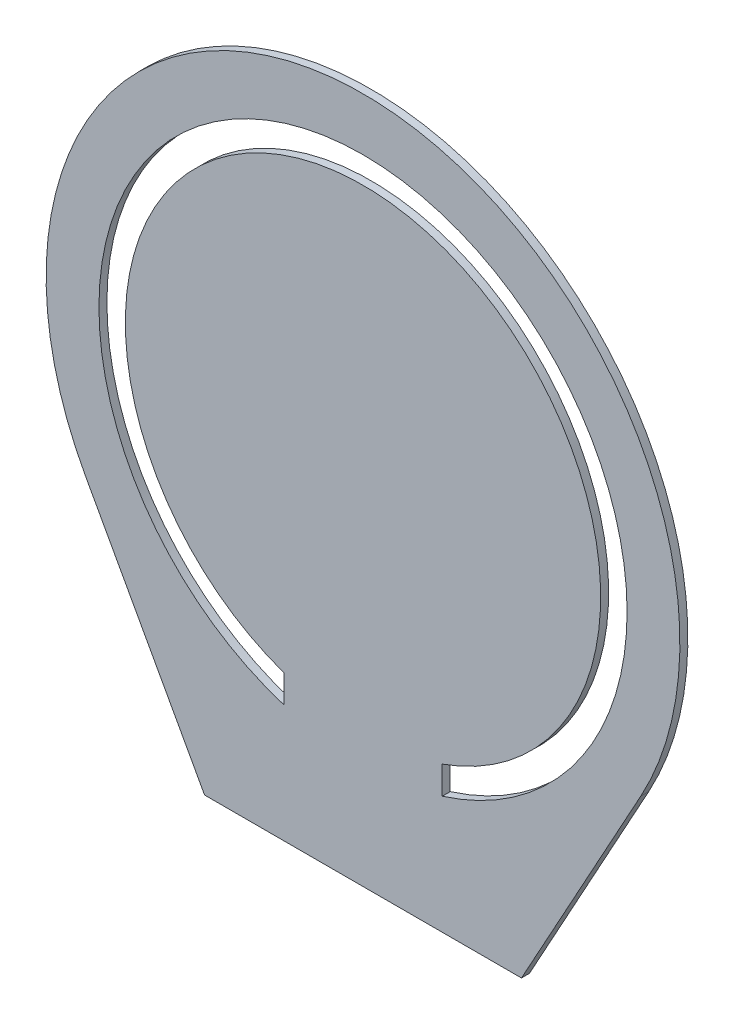
ISO-10303-21;
HEADER;
FILE_DESCRIPTION(('STEP AP214'),'2;1');
FILE_NAME('part.step','',(''),(''),'','','');
FILE_SCHEMA(('AUTOMOTIVE_DESIGN { 1 0 10303 214 1 1 1 1 }'));
ENDSEC;
DATA;
#1=APPLICATION_CONTEXT('core data for automotive mechanical design processes');
#2=APPLICATION_PROTOCOL_DEFINITION('international standard','automotive_design',2000,#1);
#3=PRODUCT_CONTEXT('',#1,'mechanical');
#4=PRODUCT('Part','Part','',(#3));
#5=PRODUCT_RELATED_PRODUCT_CATEGORY('part','',(#4));
#6=PRODUCT_DEFINITION_FORMATION('','',#4);
#7=PRODUCT_DEFINITION_CONTEXT('part definition',#1,'design');
#8=PRODUCT_DEFINITION('design','',#6,#7);
#9=PRODUCT_DEFINITION_SHAPE('','',#8);
#10=(LENGTH_UNIT() NAMED_UNIT(*) SI_UNIT(.MILLI.,.METRE.));
#11=(NAMED_UNIT(*) PLANE_ANGLE_UNIT() SI_UNIT($,.RADIAN.));
#12=(NAMED_UNIT(*) SI_UNIT($,.STERADIAN.) SOLID_ANGLE_UNIT());
#13=UNCERTAINTY_MEASURE_WITH_UNIT(LENGTH_MEASURE(1.E-05),#10,'distance_accuracy_value','');
#14=(GEOMETRIC_REPRESENTATION_CONTEXT(3) GLOBAL_UNCERTAINTY_ASSIGNED_CONTEXT((#13)) GLOBAL_UNIT_ASSIGNED_CONTEXT((#10,
#11,#12)) REPRESENTATION_CONTEXT('',''));
#15=CARTESIAN_POINT('',(0.,0.,0.));
#16=DIRECTION('',(0.,0.,1.));
#17=DIRECTION('',(1.,0.,0.));
#18=AXIS2_PLACEMENT_3D('',#15,#16,#17);
#19=CARTESIAN_POINT('',(-7.5,0.,0.75438));
#20=DIRECTION('',(-1.,0.,0.));
#21=DIRECTION('',(0.,0.,1.));
#22=AXIS2_PLACEMENT_3D('',#19,#20,#21);
#23=PLANE('',#22);
#24=DIRECTION('',(0.,1.,0.));
#25=VECTOR('',#24,1.);
#26=CARTESIAN_POINT('',(-7.5,0.,0.));
#27=LINE('',#26,#25);
#28=CARTESIAN_POINT('',(-7.5,-23.8484800354236,0.));
#29=VERTEX_POINT('',#28);
#30=CARTESIAN_POINT('',(-7.5,-21.2132034355964,0.));
#31=VERTEX_POINT('',#30);
#32=EDGE_CURVE('E154',#29,#31,#27,.T.);
#33=ORIENTED_EDGE('',*,*,#32,.F.);
#34=DIRECTION('',(0.,0.,-1.));
#35=VECTOR('',#34,1.);
#36=CARTESIAN_POINT('',(-7.5,-23.8484800354236,0.75438));
#37=LINE('',#36,#35);
#38=CARTESIAN_POINT('',(-7.5,-23.8484800354236,0.75438));
#39=VERTEX_POINT('',#38);
#40=EDGE_CURVE('E11',#39,#29,#37,.T.);
#41=ORIENTED_EDGE('',*,*,#40,.F.);
#42=DIRECTION('',(0.,1.,0.));
#43=VECTOR('',#42,1.);
#44=CARTESIAN_POINT('',(-7.5,0.,0.75438));
#45=LINE('',#44,#43);
#46=CARTESIAN_POINT('',(-7.5,-21.2132034355964,0.75438));
#47=VERTEX_POINT('',#46);
#48=EDGE_CURVE('E135',#39,#47,#45,.T.);
#49=ORIENTED_EDGE('',*,*,#48,.T.);
#50=DIRECTION('',(0.,0.,-1.));
#51=VECTOR('',#50,1.);
#52=CARTESIAN_POINT('',(-7.5,-21.2132034355964,0.75438));
#53=LINE('',#52,#51);
#54=EDGE_CURVE('E96',#47,#31,#53,.T.);
#55=ORIENTED_EDGE('',*,*,#54,.T.);
#56=EDGE_LOOP('',(#33,#41,#49,#55));
#57=FACE_BOUND('',#56,.T.);
#58=ADVANCED_FACE('F42',(#57),#23,.T.);
#59=CARTESIAN_POINT('',(0.,0.,0.75438));
#60=DIRECTION('',(0.,0.,-1.));
#61=DIRECTION('',(-1.,0.,0.));
#62=AXIS2_PLACEMENT_3D('',#59,#60,#61);
#63=CYLINDRICAL_SURFACE('',#62,25.);
#64=CARTESIAN_POINT('',(0.,0.,0.));
#65=DIRECTION('',(0.,0.,1.));
#66=DIRECTION('',(1.,0.,0.));
#67=AXIS2_PLACEMENT_3D('',#64,#65,#66);
#68=CIRCLE('',#67,25.);
#69=CARTESIAN_POINT('',(7.5,-23.8484800354236,0.));
#70=VERTEX_POINT('',#69);
#71=EDGE_CURVE('E125',#70,#29,#68,.T.);
#72=ORIENTED_EDGE('',*,*,#71,.F.);
#73=DIRECTION('',(0.,0.,-1.));
#74=VECTOR('',#73,1.);
#75=CARTESIAN_POINT('',(7.5,-23.8484800354236,0.75438));
#76=LINE('',#75,#74);
#77=CARTESIAN_POINT('',(7.5,-23.8484800354236,0.75438));
#78=VERTEX_POINT('',#77);
#79=EDGE_CURVE('E52',#78,#70,#76,.T.);
#80=ORIENTED_EDGE('',*,*,#79,.F.);
#81=CARTESIAN_POINT('',(0.,0.,0.75438));
#82=DIRECTION('',(0.,0.,1.));
#83=DIRECTION('',(1.,0.,0.));
#84=AXIS2_PLACEMENT_3D('',#81,#82,#83);
#85=CIRCLE('',#84,25.);
#86=EDGE_CURVE('E123',#78,#39,#85,.T.);
#87=ORIENTED_EDGE('',*,*,#86,.T.);
#88=ORIENTED_EDGE('',*,*,#40,.T.);
#89=EDGE_LOOP('',(#72,#80,#87,#88));
#90=FACE_BOUND('',#89,.T.);
#91=ADVANCED_FACE('F121',(#90),#63,.F.);
#92=CARTESIAN_POINT('',(7.5,0.,0.75438));
#93=DIRECTION('',(-1.,0.,0.));
#94=DIRECTION('',(0.,0.,1.));
#95=AXIS2_PLACEMENT_3D('',#92,#93,#94);
#96=PLANE('',#95);
#97=DIRECTION('',(0.,1.,0.));
#98=VECTOR('',#97,1.);
#99=CARTESIAN_POINT('',(7.5,0.,0.));
#100=LINE('',#99,#98);
#101=CARTESIAN_POINT('',(7.5,-21.2132034355964,0.));
#102=VERTEX_POINT('',#101);
#103=EDGE_CURVE('E157',#70,#102,#100,.T.);
#104=ORIENTED_EDGE('',*,*,#103,.T.);
#105=DIRECTION('',(0.,0.,-1.));
#106=VECTOR('',#105,1.);
#107=CARTESIAN_POINT('',(7.5,-21.2132034355964,0.75438));
#108=LINE('',#107,#106);
#109=CARTESIAN_POINT('',(7.5,-21.2132034355964,0.75438));
#110=VERTEX_POINT('',#109);
#111=EDGE_CURVE('E128',#110,#102,#108,.T.);
#112=ORIENTED_EDGE('',*,*,#111,.F.);
#113=DIRECTION('',(0.,1.,0.));
#114=VECTOR('',#113,1.);
#115=CARTESIAN_POINT('',(7.5,0.,0.75438));
#116=LINE('',#115,#114);
#117=EDGE_CURVE('E131',#78,#110,#116,.T.);
#118=ORIENTED_EDGE('',*,*,#117,.F.);
#119=ORIENTED_EDGE('',*,*,#79,.T.);
#120=EDGE_LOOP('',(#104,#112,#118,#119));
#121=FACE_BOUND('',#120,.T.);
#122=ADVANCED_FACE('F132',(#121),#96,.F.);
#123=CARTESIAN_POINT('',(0.,-35.,0.75438));
#124=DIRECTION('',(0.,1.,0.));
#125=DIRECTION('',(-1.,0.,0.));
#126=AXIS2_PLACEMENT_3D('',#123,#124,#125);
#127=PLANE('',#126);
#128=DIRECTION('',(1.,0.,0.));
#129=VECTOR('',#128,1.);
#130=CARTESIAN_POINT('',(0.,-35.,0.));
#131=LINE('',#130,#129);
#132=CARTESIAN_POINT('',(-15.,-35.,0.));
#133=VERTEX_POINT('',#132);
#134=CARTESIAN_POINT('',(15.,-35.,0.));
#135=VERTEX_POINT('',#134);
#136=EDGE_CURVE('E143',#133,#135,#131,.T.);
#137=ORIENTED_EDGE('',*,*,#136,.T.);
#138=DIRECTION('',(0.,0.,-1.));
#139=VECTOR('',#138,1.);
#140=CARTESIAN_POINT('',(15.,-35.,0.75438));
#141=LINE('',#140,#139);
#142=CARTESIAN_POINT('',(15.,-35.,0.75438));
#143=VERTEX_POINT('',#142);
#144=EDGE_CURVE('E46',#143,#135,#141,.T.);
#145=ORIENTED_EDGE('',*,*,#144,.F.);
#146=DIRECTION('',(1.,0.,0.));
#147=VECTOR('',#146,1.);
#148=CARTESIAN_POINT('',(0.,-35.,0.75438));
#149=LINE('',#148,#147);
#150=CARTESIAN_POINT('',(-15.,-35.,0.75438));
#151=VERTEX_POINT('',#150);
#152=EDGE_CURVE('E160',#151,#143,#149,.T.);
#153=ORIENTED_EDGE('',*,*,#152,.F.);
#154=DIRECTION('',(0.,0.,-1.));
#155=VECTOR('',#154,1.);
#156=CARTESIAN_POINT('',(-15.,-35.,0.75438));
#157=LINE('',#156,#155);
#158=EDGE_CURVE('E142',#151,#133,#157,.T.);
#159=ORIENTED_EDGE('',*,*,#158,.T.);
#160=EDGE_LOOP('',(#137,#145,#153,#159));
#161=FACE_BOUND('',#160,.T.);
#162=ADVANCED_FACE('F44',(#161),#127,.F.);
#163=CARTESIAN_POINT('',(26.2928846476366,-14.4459065795844,0.75438));
#164=DIRECTION('',(-0.876429488254551,0.481530219319478,0.));
#165=DIRECTION('',(-0.481530219319478,-0.876429488254552,0.));
#166=AXIS2_PLACEMENT_3D('',#163,#164,#165);
#167=PLANE('',#166);
#168=DIRECTION('',(0.481530219319478,0.876429488254552,0.));
#169=VECTOR('',#168,1.);
#170=CARTESIAN_POINT('',(26.2928846476366,-14.4459065795844,0.));
#171=LINE('',#170,#169);
#172=CARTESIAN_POINT('',(26.2928846476366,-14.4459065795843,0.));
#173=VERTEX_POINT('',#172);
#174=EDGE_CURVE('E146',#135,#173,#171,.T.);
#175=ORIENTED_EDGE('',*,*,#174,.T.);
#176=DIRECTION('',(0.,0.,-1.));
#177=VECTOR('',#176,1.);
#178=CARTESIAN_POINT('',(26.2928846476366,-14.4459065795843,0.75438));
#179=LINE('',#178,#177);
#180=CARTESIAN_POINT('',(26.2928846476366,-14.4459065795843,0.75438));
#181=VERTEX_POINT('',#180);
#182=EDGE_CURVE('E165',#181,#173,#179,.T.);
#183=ORIENTED_EDGE('',*,*,#182,.F.);
#184=DIRECTION('',(0.481530219319478,0.876429488254552,0.));
#185=VECTOR('',#184,1.);
#186=CARTESIAN_POINT('',(26.2928846476366,-14.4459065795844,0.75438));
#187=LINE('',#186,#185);
#188=EDGE_CURVE('E104',#143,#181,#187,.T.);
#189=ORIENTED_EDGE('',*,*,#188,.F.);
#190=ORIENTED_EDGE('',*,*,#144,.T.);
#191=EDGE_LOOP('',(#175,#183,#189,#190));
#192=FACE_BOUND('',#191,.T.);
#193=ADVANCED_FACE('F171',(#192),#167,.F.);
#194=CARTESIAN_POINT('',(0.,0.,0.75438));
#195=DIRECTION('',(0.,0.,-1.));
#196=DIRECTION('',(-1.,0.,0.));
#197=AXIS2_PLACEMENT_3D('',#194,#195,#196);
#198=CYLINDRICAL_SURFACE('',#197,30.);
#199=CARTESIAN_POINT('',(0.,0.,0.));
#200=DIRECTION('',(0.,0.,1.));
#201=DIRECTION('',(1.,0.,0.));
#202=AXIS2_PLACEMENT_3D('',#199,#200,#201);
#203=CIRCLE('',#202,30.);
#204=CARTESIAN_POINT('',(-26.2928846476366,-14.4459065795843,0.));
#205=VERTEX_POINT('',#204);
#206=EDGE_CURVE('E148',#173,#205,#203,.T.);
#207=ORIENTED_EDGE('',*,*,#206,.T.);
#208=DIRECTION('',(0.,0.,-1.));
#209=VECTOR('',#208,1.);
#210=CARTESIAN_POINT('',(-26.2928846476366,-14.4459065795843,0.75438));
#211=LINE('',#210,#209);
#212=CARTESIAN_POINT('',(-26.2928846476366,-14.4459065795843,0.75438));
#213=VERTEX_POINT('',#212);
#214=EDGE_CURVE('E164',#213,#205,#211,.T.);
#215=ORIENTED_EDGE('',*,*,#214,.F.);
#216=CARTESIAN_POINT('',(0.,0.,0.75438));
#217=DIRECTION('',(0.,0.,1.));
#218=DIRECTION('',(1.,0.,0.));
#219=AXIS2_PLACEMENT_3D('',#216,#217,#218);
#220=CIRCLE('',#219,30.);
#221=EDGE_CURVE('E211',#181,#213,#220,.T.);
#222=ORIENTED_EDGE('',*,*,#221,.F.);
#223=ORIENTED_EDGE('',*,*,#182,.T.);
#224=EDGE_LOOP('',(#207,#215,#222,#223));
#225=FACE_BOUND('',#224,.T.);
#226=ADVANCED_FACE('F183',(#225),#198,.T.);
#227=CARTESIAN_POINT('',(-26.2928846476366,-14.4459065795843,0.75438));
#228=DIRECTION('',(-0.876429488254552,-0.481530219319478,0.));
#229=DIRECTION('',(0.481530219319478,-0.876429488254552,0.));
#230=AXIS2_PLACEMENT_3D('',#227,#228,#229);
#231=PLANE('',#230);
#232=DIRECTION('',(-0.481530219319478,0.876429488254552,0.));
#233=VECTOR('',#232,1.);
#234=CARTESIAN_POINT('',(-26.2928846476366,-14.4459065795843,0.));
#235=LINE('',#234,#233);
#236=EDGE_CURVE('E151',#133,#205,#235,.T.);
#237=ORIENTED_EDGE('',*,*,#236,.F.);
#238=ORIENTED_EDGE('',*,*,#158,.F.);
#239=DIRECTION('',(-0.481530219319478,0.876429488254552,0.));
#240=VECTOR('',#239,1.);
#241=CARTESIAN_POINT('',(-26.2928846476366,-14.4459065795843,0.75438));
#242=LINE('',#241,#240);
#243=EDGE_CURVE('E137',#151,#213,#242,.T.);
#244=ORIENTED_EDGE('',*,*,#243,.T.);
#245=ORIENTED_EDGE('',*,*,#214,.T.);
#246=EDGE_LOOP('',(#237,#238,#244,#245));
#247=FACE_BOUND('',#246,.T.);
#248=ADVANCED_FACE('F179',(#247),#231,.T.);
#249=CARTESIAN_POINT('',(0.,0.,0.75438));
#250=DIRECTION('',(0.,0.,-1.));
#251=DIRECTION('',(-1.,0.,0.));
#252=AXIS2_PLACEMENT_3D('',#249,#250,#251);
#253=CYLINDRICAL_SURFACE('',#252,22.5);
#254=CARTESIAN_POINT('',(0.,0.,0.));
#255=DIRECTION('',(0.,0.,1.));
#256=DIRECTION('',(1.,0.,0.));
#257=AXIS2_PLACEMENT_3D('',#254,#255,#256);
#258=CIRCLE('',#257,22.5);
#259=EDGE_CURVE('E89',#102,#31,#258,.T.);
#260=ORIENTED_EDGE('',*,*,#259,.T.);
#261=ORIENTED_EDGE('',*,*,#54,.F.);
#262=CARTESIAN_POINT('',(0.,0.,0.75438));
#263=DIRECTION('',(0.,0.,1.));
#264=DIRECTION('',(1.,0.,0.));
#265=AXIS2_PLACEMENT_3D('',#262,#263,#264);
#266=CIRCLE('',#265,22.5);
#267=EDGE_CURVE('E61',#110,#47,#266,.T.);
#268=ORIENTED_EDGE('',*,*,#267,.F.);
#269=ORIENTED_EDGE('',*,*,#111,.T.);
#270=EDGE_LOOP('',(#260,#261,#268,#269));
#271=FACE_BOUND('',#270,.T.);
#272=ADVANCED_FACE('F190',(#271),#253,.T.);
#273=CARTESIAN_POINT('',(0.,0.,0.75438));
#274=DIRECTION('',(0.,0.,1.));
#275=DIRECTION('',(1.,0.,0.));
#276=AXIS2_PLACEMENT_3D('',#273,#274,#275);
#277=PLANE('',#276);
#278=ORIENTED_EDGE('',*,*,#152,.T.);
#279=ORIENTED_EDGE('',*,*,#188,.T.);
#280=ORIENTED_EDGE('',*,*,#221,.T.);
#281=ORIENTED_EDGE('',*,*,#243,.F.);
#282=EDGE_LOOP('',(#278,#279,#280,#281));
#283=FACE_BOUND('',#282,.T.);
#284=ORIENTED_EDGE('',*,*,#48,.F.);
#285=ORIENTED_EDGE('',*,*,#86,.F.);
#286=ORIENTED_EDGE('',*,*,#117,.T.);
#287=ORIENTED_EDGE('',*,*,#267,.T.);
#288=EDGE_LOOP('',(#284,#285,#286,#287));
#289=FACE_BOUND('',#288,.T.);
#290=ADVANCED_FACE('F134',(#283,#289),#277,.T.);
#291=CARTESIAN_POINT('',(0.,0.,0.));
#292=DIRECTION('',(0.,0.,1.));
#293=DIRECTION('',(1.,0.,0.));
#294=AXIS2_PLACEMENT_3D('',#291,#292,#293);
#295=PLANE('',#294);
#296=ORIENTED_EDGE('',*,*,#136,.F.);
#297=ORIENTED_EDGE('',*,*,#236,.T.);
#298=ORIENTED_EDGE('',*,*,#206,.F.);
#299=ORIENTED_EDGE('',*,*,#174,.F.);
#300=EDGE_LOOP('',(#296,#297,#298,#299));
#301=FACE_BOUND('',#300,.T.);
#302=ORIENTED_EDGE('',*,*,#32,.T.);
#303=ORIENTED_EDGE('',*,*,#259,.F.);
#304=ORIENTED_EDGE('',*,*,#103,.F.);
#305=ORIENTED_EDGE('',*,*,#71,.T.);
#306=EDGE_LOOP('',(#302,#303,#304,#305));
#307=FACE_BOUND('',#306,.T.);
#308=ADVANCED_FACE('F177',(#301,#307),#295,.F.);
#309=CLOSED_SHELL('',(#58,#91,#122,#162,#193,#226,#248,#272,#290,#308));
#310=MANIFOLD_SOLID_BREP('B2',#309);
#311=ADVANCED_BREP_SHAPE_REPRESENTATION('',(#18,#310),#14);
#312=SHAPE_DEFINITION_REPRESENTATION(#9,#311);
ENDSEC;
END-ISO-10303-21;
